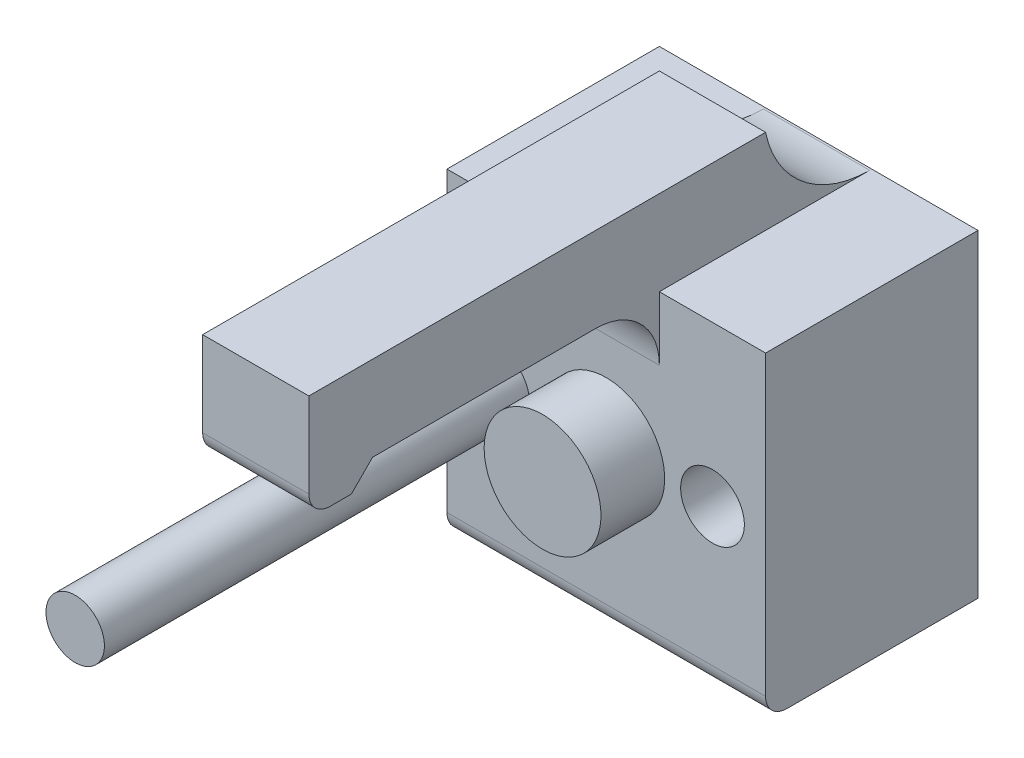
ISO-10303-21;
HEADER;
FILE_DESCRIPTION(('STEP AP214'),'2;1');
FILE_NAME('part.step','',(''),(''),'','','');
FILE_SCHEMA(('AUTOMOTIVE_DESIGN { 1 0 10303 214 1 1 1 1 }'));
ENDSEC;
DATA;
#1=APPLICATION_CONTEXT('core data for automotive mechanical design processes');
#2=APPLICATION_PROTOCOL_DEFINITION('international standard','automotive_design',2000,#1);
#3=PRODUCT_CONTEXT('',#1,'mechanical');
#4=PRODUCT('Part','Part','',(#3));
#5=PRODUCT_RELATED_PRODUCT_CATEGORY('part','',(#4));
#6=PRODUCT_DEFINITION_FORMATION('','',#4);
#7=PRODUCT_DEFINITION_CONTEXT('part definition',#1,'design');
#8=PRODUCT_DEFINITION('design','',#6,#7);
#9=PRODUCT_DEFINITION_SHAPE('','',#8);
#10=(LENGTH_UNIT() NAMED_UNIT(*) SI_UNIT(.MILLI.,.METRE.));
#11=(NAMED_UNIT(*) PLANE_ANGLE_UNIT() SI_UNIT($,.RADIAN.));
#12=(NAMED_UNIT(*) SI_UNIT($,.STERADIAN.) SOLID_ANGLE_UNIT());
#13=UNCERTAINTY_MEASURE_WITH_UNIT(LENGTH_MEASURE(1.E-05),#10,'distance_accuracy_value','');
#14=(GEOMETRIC_REPRESENTATION_CONTEXT(3) GLOBAL_UNCERTAINTY_ASSIGNED_CONTEXT((#13)) GLOBAL_UNIT_ASSIGNED_CONTEXT((#10,
#11,#12)) REPRESENTATION_CONTEXT('',''));
#15=CARTESIAN_POINT('',(0.,0.,0.));
#16=DIRECTION('',(0.,0.,1.));
#17=DIRECTION('',(1.,0.,0.));
#18=AXIS2_PLACEMENT_3D('',#15,#16,#17);
#19=CARTESIAN_POINT('',(0.,7.5,40.));
#20=DIRECTION('',(0.,1.,0.));
#21=DIRECTION('',(0.,0.,-1.));
#22=AXIS2_PLACEMENT_3D('',#19,#20,#21);
#23=PLANE('',#22);
#24=DIRECTION('',(0.,0.,1.));
#25=VECTOR('',#24,1.);
#26=CARTESIAN_POINT('',(-2.5,7.5,40.));
#27=LINE('',#26,#25);
#28=CARTESIAN_POINT('',(-2.5,7.5,43.));
#29=VERTEX_POINT('',#28);
#30=CARTESIAN_POINT('',(-2.5,7.5,53.5));
#31=VERTEX_POINT('',#30);
#32=EDGE_CURVE('E190',#29,#31,#27,.T.);
#33=ORIENTED_EDGE('',*,*,#32,.F.);
#34=DIRECTION('',(-1.,0.,0.));
#35=VECTOR('',#34,1.);
#36=CARTESIAN_POINT('',(0.,7.5,43.));
#37=LINE('',#36,#35);
#38=CARTESIAN_POINT('',(2.5,7.5,43.));
#39=VERTEX_POINT('',#38);
#40=EDGE_CURVE('E285',#39,#29,#37,.T.);
#41=ORIENTED_EDGE('',*,*,#40,.F.);
#42=DIRECTION('',(0.,0.,-1.));
#43=VECTOR('',#42,1.);
#44=CARTESIAN_POINT('',(2.5,7.5,40.));
#45=LINE('',#44,#43);
#46=CARTESIAN_POINT('',(2.5,7.5,53.5));
#47=VERTEX_POINT('',#46);
#48=EDGE_CURVE('E192',#47,#39,#45,.T.);
#49=ORIENTED_EDGE('',*,*,#48,.F.);
#50=DIRECTION('',(1.,0.,0.));
#51=VECTOR('',#50,1.);
#52=CARTESIAN_POINT('',(-3.9142135623731,7.5,53.5));
#53=LINE('',#52,#51);
#54=EDGE_CURVE('E177',#31,#47,#53,.T.);
#55=ORIENTED_EDGE('',*,*,#54,.F.);
#56=EDGE_LOOP('',(#33,#41,#49,#55));
#57=FACE_BOUND('',#56,.T.);
#58=ADVANCED_FACE('F43',(#57),#23,.F.);
#59=CARTESIAN_POINT('',(7.5,-7.5,30.));
#60=DIRECTION('',(-1.,0.,0.));
#61=DIRECTION('',(0.,0.,-1.));
#62=AXIS2_PLACEMENT_3D('',#59,#60,#61);
#63=PLANE('',#62);
#64=DIRECTION('',(0.,0.,1.));
#65=VECTOR('',#64,1.);
#66=CARTESIAN_POINT('',(7.5,-7.5,30.));
#67=LINE('',#66,#65);
#68=CARTESIAN_POINT('',(7.5,-7.5,30.));
#69=VERTEX_POINT('',#68);
#70=CARTESIAN_POINT('',(7.5,-7.5,39.));
#71=VERTEX_POINT('',#70);
#72=EDGE_CURVE('E250',#69,#71,#67,.T.);
#73=ORIENTED_EDGE('',*,*,#72,.F.);
#74=DIRECTION('',(0.,1.,0.));
#75=VECTOR('',#74,1.);
#76=CARTESIAN_POINT('',(7.5,-7.5,30.));
#77=LINE('',#76,#75);
#78=CARTESIAN_POINT('',(7.5,7.5,30.));
#79=VERTEX_POINT('',#78);
#80=EDGE_CURVE('E234',#69,#79,#77,.T.);
#81=ORIENTED_EDGE('',*,*,#80,.T.);
#82=DIRECTION('',(0.,0.,1.));
#83=VECTOR('',#82,1.);
#84=CARTESIAN_POINT('',(7.5,7.5,30.));
#85=LINE('',#84,#83);
#86=CARTESIAN_POINT('',(7.5,7.5,40.));
#87=VERTEX_POINT('',#86);
#88=EDGE_CURVE('E233',#79,#87,#85,.T.);
#89=ORIENTED_EDGE('',*,*,#88,.T.);
#90=DIRECTION('',(0.,1.,0.));
#91=VECTOR('',#90,1.);
#92=CARTESIAN_POINT('',(7.5,-7.5,40.));
#93=LINE('',#92,#91);
#94=CARTESIAN_POINT('',(7.5,-6.5,40.));
#95=VERTEX_POINT('',#94);
#96=EDGE_CURVE('E228',#95,#87,#93,.T.);
#97=ORIENTED_EDGE('',*,*,#96,.F.);
#98=CARTESIAN_POINT('',(7.5,-6.5,39.));
#99=DIRECTION('',(1.,0.,0.));
#100=DIRECTION('',(0.,0.,-1.));
#101=AXIS2_PLACEMENT_3D('',#98,#99,#100);
#102=CIRCLE('',#101,1.);
#103=EDGE_CURVE('E320',#71,#95,#102,.F.);
#104=ORIENTED_EDGE('',*,*,#103,.F.);
#105=EDGE_LOOP('',(#73,#81,#89,#97,#104));
#106=FACE_BOUND('',#105,.T.);
#107=ADVANCED_FACE('F429',(#106),#63,.F.);
#108=CARTESIAN_POINT('',(-7.5,7.5,30.));
#109=DIRECTION('',(0.,-1.,0.));
#110=DIRECTION('',(0.,0.,1.));
#111=AXIS2_PLACEMENT_3D('',#108,#109,#110);
#112=PLANE('',#111);
#113=CARTESIAN_POINT('',(2.5,7.5,40.));
#114=VERTEX_POINT('',#113);
#115=CARTESIAN_POINT('',(2.5,7.5,30.1010205144336));
#116=VERTEX_POINT('',#115);
#117=EDGE_CURVE('E215',#114,#116,#45,.T.);
#118=ORIENTED_EDGE('',*,*,#117,.F.);
#119=DIRECTION('',(-1.,0.,0.));
#120=VECTOR('',#119,1.);
#121=CARTESIAN_POINT('',(-7.5,7.5,40.));
#122=LINE('',#121,#120);
#123=EDGE_CURVE('E254',#87,#114,#122,.T.);
#124=ORIENTED_EDGE('',*,*,#123,.F.);
#125=ORIENTED_EDGE('',*,*,#88,.F.);
#126=DIRECTION('',(-1.,0.,0.));
#127=VECTOR('',#126,1.);
#128=CARTESIAN_POINT('',(-7.5,7.5,30.));
#129=LINE('',#128,#127);
#130=CARTESIAN_POINT('',(-7.5,7.5,30.));
#131=VERTEX_POINT('',#130);
#132=EDGE_CURVE('E238',#79,#131,#129,.T.);
#133=ORIENTED_EDGE('',*,*,#132,.T.);
#134=DIRECTION('',(0.,0.,1.));
#135=VECTOR('',#134,1.);
#136=CARTESIAN_POINT('',(-7.5,7.5,30.));
#137=LINE('',#136,#135);
#138=CARTESIAN_POINT('',(-7.5,7.5,40.));
#139=VERTEX_POINT('',#138);
#140=EDGE_CURVE('E267',#131,#139,#137,.T.);
#141=ORIENTED_EDGE('',*,*,#140,.T.);
#142=CARTESIAN_POINT('',(-2.5,7.5,40.));
#143=VERTEX_POINT('',#142);
#144=EDGE_CURVE('E253',#143,#139,#122,.T.);
#145=ORIENTED_EDGE('',*,*,#144,.F.);
#146=CARTESIAN_POINT('',(-2.5,7.5,30.1010205144336));
#147=VERTEX_POINT('',#146);
#148=EDGE_CURVE('E201',#147,#143,#27,.T.);
#149=ORIENTED_EDGE('',*,*,#148,.F.);
#150=DIRECTION('',(1.,0.,0.));
#151=VECTOR('',#150,1.);
#152=CARTESIAN_POINT('',(-7.5,7.5,30.1010205144336));
#153=LINE('',#152,#151);
#154=EDGE_CURVE('E274',#116,#147,#153,.F.);
#155=ORIENTED_EDGE('',*,*,#154,.F.);
#156=EDGE_LOOP('',(#118,#124,#125,#133,#141,#145,#149,#155));
#157=FACE_BOUND('',#156,.T.);
#158=ADVANCED_FACE('F438',(#157),#112,.F.);
#159=CARTESIAN_POINT('',(-7.5,-7.5,30.));
#160=DIRECTION('',(1.,0.,0.));
#161=DIRECTION('',(0.,0.,1.));
#162=AXIS2_PLACEMENT_3D('',#159,#160,#161);
#163=PLANE('',#162);
#164=DIRECTION('',(0.,-1.,0.));
#165=VECTOR('',#164,1.);
#166=CARTESIAN_POINT('',(-7.5,-7.5,40.));
#167=LINE('',#166,#165);
#168=CARTESIAN_POINT('',(-7.5,-6.5,40.));
#169=VERTEX_POINT('',#168);
#170=EDGE_CURVE('E239',#139,#169,#167,.T.);
#171=ORIENTED_EDGE('',*,*,#170,.F.);
#172=ORIENTED_EDGE('',*,*,#140,.F.);
#173=DIRECTION('',(0.,-1.,0.));
#174=VECTOR('',#173,1.);
#175=CARTESIAN_POINT('',(-7.5,-7.5,30.));
#176=LINE('',#175,#174);
#177=CARTESIAN_POINT('',(-7.5,-7.5,30.));
#178=VERTEX_POINT('',#177);
#179=EDGE_CURVE('E243',#131,#178,#176,.T.);
#180=ORIENTED_EDGE('',*,*,#179,.T.);
#181=DIRECTION('',(0.,0.,1.));
#182=VECTOR('',#181,1.);
#183=CARTESIAN_POINT('',(-7.5,-7.5,30.));
#184=LINE('',#183,#182);
#185=CARTESIAN_POINT('',(-7.5,-7.5,39.));
#186=VERTEX_POINT('',#185);
#187=EDGE_CURVE('E263',#178,#186,#184,.T.);
#188=ORIENTED_EDGE('',*,*,#187,.T.);
#189=CARTESIAN_POINT('',(-7.5,-6.5,39.));
#190=DIRECTION('',(-1.,0.,0.));
#191=DIRECTION('',(0.,0.,1.));
#192=AXIS2_PLACEMENT_3D('',#189,#190,#191);
#193=CIRCLE('',#192,1.);
#194=EDGE_CURVE('E11',#169,#186,#193,.F.);
#195=ORIENTED_EDGE('',*,*,#194,.F.);
#196=EDGE_LOOP('',(#171,#172,#180,#188,#195));
#197=FACE_BOUND('',#196,.T.);
#198=ADVANCED_FACE('F434',(#197),#163,.F.);
#199=CARTESIAN_POINT('',(-7.5,-7.5,30.));
#200=DIRECTION('',(0.,1.,0.));
#201=DIRECTION('',(0.,0.,-1.));
#202=AXIS2_PLACEMENT_3D('',#199,#200,#201);
#203=PLANE('',#202);
#204=DIRECTION('',(1.,0.,0.));
#205=VECTOR('',#204,1.);
#206=CARTESIAN_POINT('',(0.,-7.5,38.8385020515367));
#207=LINE('',#206,#205);
#208=CARTESIAN_POINT('',(-2.75,-7.5,38.8385020515367));
#209=VERTEX_POINT('',#208);
#210=CARTESIAN_POINT('',(2.75,-7.5,38.8385020515367));
#211=VERTEX_POINT('',#210);
#212=EDGE_CURVE('E369',#209,#211,#207,.T.);
#213=ORIENTED_EDGE('',*,*,#212,.T.);
#214=DIRECTION('',(0.,0.,1.));
#215=VECTOR('',#214,1.);
#216=CARTESIAN_POINT('',(2.75,-7.5,40.));
#217=LINE('',#216,#215);
#218=CARTESIAN_POINT('',(2.75,-7.5,31.1614979484633));
#219=VERTEX_POINT('',#218);
#220=EDGE_CURVE('E365',#219,#211,#217,.T.);
#221=ORIENTED_EDGE('',*,*,#220,.F.);
#222=DIRECTION('',(1.,0.,0.));
#223=VECTOR('',#222,1.);
#224=CARTESIAN_POINT('',(0.,-7.5,31.1614979484633));
#225=LINE('',#224,#223);
#226=CARTESIAN_POINT('',(-2.75,-7.5,31.1614979484633));
#227=VERTEX_POINT('',#226);
#228=EDGE_CURVE('E360',#227,#219,#225,.T.);
#229=ORIENTED_EDGE('',*,*,#228,.F.);
#230=DIRECTION('',(0.,0.,1.));
#231=VECTOR('',#230,1.);
#232=CARTESIAN_POINT('',(-2.75,-7.5,40.));
#233=LINE('',#232,#231);
#234=EDGE_CURVE('E185',#227,#209,#233,.T.);
#235=ORIENTED_EDGE('',*,*,#234,.T.);
#236=EDGE_LOOP('',(#213,#221,#229,#235));
#237=FACE_BOUND('',#236,.T.);
#238=ORIENTED_EDGE('',*,*,#187,.F.);
#239=DIRECTION('',(1.,0.,0.));
#240=VECTOR('',#239,1.);
#241=CARTESIAN_POINT('',(-7.5,-7.5,30.));
#242=LINE('',#241,#240);
#243=EDGE_CURVE('E247',#178,#69,#242,.T.);
#244=ORIENTED_EDGE('',*,*,#243,.T.);
#245=ORIENTED_EDGE('',*,*,#72,.T.);
#246=DIRECTION('',(1.,0.,0.));
#247=VECTOR('',#246,1.);
#248=CARTESIAN_POINT('',(7.5,-7.5,39.));
#249=LINE('',#248,#247);
#250=EDGE_CURVE('E317',#186,#71,#249,.T.);
#251=ORIENTED_EDGE('',*,*,#250,.F.);
#252=EDGE_LOOP('',(#238,#244,#245,#251));
#253=FACE_BOUND('',#252,.T.);
#254=ADVANCED_FACE('F421',(#237,#253),#203,.F.);
#255=CARTESIAN_POINT('',(0.,0.,30.));
#256=DIRECTION('',(0.,0.,1.));
#257=DIRECTION('',(-1.,0.,0.));
#258=AXIS2_PLACEMENT_3D('',#255,#256,#257);
#259=PLANE('',#258);
#260=CARTESIAN_POINT('',(5.,0.,30.));
#261=DIRECTION('',(0.,0.,-1.));
#262=DIRECTION('',(-1.,0.,0.));
#263=AXIS2_PLACEMENT_3D('',#260,#261,#262);
#264=CIRCLE('',#263,1.5);
#265=CARTESIAN_POINT('',(3.5,0.,30.));
#266=VERTEX_POINT('',#265);
#267=EDGE_CURVE('E396',#266,#266,#264,.T.);
#268=ORIENTED_EDGE('',*,*,#267,.F.);
#269=EDGE_LOOP('',(#268));
#270=FACE_BOUND('',#269,.T.);
#271=ORIENTED_EDGE('',*,*,#80,.F.);
#272=ORIENTED_EDGE('',*,*,#243,.F.);
#273=ORIENTED_EDGE('',*,*,#179,.F.);
#274=ORIENTED_EDGE('',*,*,#132,.F.);
#275=EDGE_LOOP('',(#271,#272,#273,#274));
#276=FACE_BOUND('',#275,.T.);
#277=ADVANCED_FACE('F418',(#270,#276),#259,.F.);
#278=CARTESIAN_POINT('',(0.,0.,40.));
#279=DIRECTION('',(0.,0.,1.));
#280=DIRECTION('',(-1.,0.,0.));
#281=AXIS2_PLACEMENT_3D('',#278,#279,#280);
#282=PLANE('',#281);
#283=CARTESIAN_POINT('',(5.,0.,40.));
#284=DIRECTION('',(0.,0.,-1.));
#285=DIRECTION('',(-1.,0.,0.));
#286=AXIS2_PLACEMENT_3D('',#283,#284,#285);
#287=CIRCLE('',#286,1.5);
#288=CARTESIAN_POINT('',(3.5,0.,40.));
#289=VERTEX_POINT('',#288);
#290=EDGE_CURVE('E403',#289,#289,#287,.T.);
#291=ORIENTED_EDGE('',*,*,#290,.T.);
#292=EDGE_LOOP('',(#291));
#293=FACE_BOUND('',#292,.T.);
#294=CARTESIAN_POINT('',(-5.,0.,40.));
#295=DIRECTION('',(0.,0.,-1.));
#296=DIRECTION('',(-1.,0.,0.));
#297=AXIS2_PLACEMENT_3D('',#294,#295,#296);
#298=CIRCLE('',#297,1.375);
#299=CARTESIAN_POINT('',(-6.375,0.,40.));
#300=VERTEX_POINT('',#299);
#301=EDGE_CURVE('E392',#300,#300,#298,.T.);
#302=ORIENTED_EDGE('',*,*,#301,.T.);
#303=EDGE_LOOP('',(#302));
#304=FACE_BOUND('',#303,.T.);
#305=CARTESIAN_POINT('',(0.,0.,40.));
#306=DIRECTION('',(0.,0.,-1.));
#307=DIRECTION('',(-1.,0.,0.));
#308=AXIS2_PLACEMENT_3D('',#305,#306,#307);
#309=CIRCLE('',#308,2.75);
#310=CARTESIAN_POINT('',(-2.75,0.,40.));
#311=VERTEX_POINT('',#310);
#312=EDGE_CURVE('E229',#311,#311,#309,.T.);
#313=ORIENTED_EDGE('',*,*,#312,.T.);
#314=EDGE_LOOP('',(#313));
#315=FACE_BOUND('',#314,.T.);
#316=ORIENTED_EDGE('',*,*,#96,.T.);
#317=ORIENTED_EDGE('',*,*,#123,.T.);
#318=DIRECTION('',(0.,1.,0.));
#319=VECTOR('',#318,1.);
#320=CARTESIAN_POINT('',(2.5,11.5,40.));
#321=LINE('',#320,#319);
#322=CARTESIAN_POINT('',(2.5,4.5,40.));
#323=VERTEX_POINT('',#322);
#324=EDGE_CURVE('E288',#323,#114,#321,.T.);
#325=ORIENTED_EDGE('',*,*,#324,.F.);
#326=DIRECTION('',(-1.,0.,0.));
#327=VECTOR('',#326,1.);
#328=CARTESIAN_POINT('',(0.,4.5,40.));
#329=LINE('',#328,#327);
#330=CARTESIAN_POINT('',(-2.5,4.5,40.));
#331=VERTEX_POINT('',#330);
#332=EDGE_CURVE('E291',#331,#323,#329,.F.);
#333=ORIENTED_EDGE('',*,*,#332,.F.);
#334=DIRECTION('',(0.,-1.,0.));
#335=VECTOR('',#334,1.);
#336=CARTESIAN_POINT('',(-2.5,11.5,40.));
#337=LINE('',#336,#335);
#338=EDGE_CURVE('E295',#143,#331,#337,.T.);
#339=ORIENTED_EDGE('',*,*,#338,.F.);
#340=ORIENTED_EDGE('',*,*,#144,.T.);
#341=ORIENTED_EDGE('',*,*,#170,.T.);
#342=DIRECTION('',(1.,0.,0.));
#343=VECTOR('',#342,1.);
#344=CARTESIAN_POINT('',(-7.5,-6.5,40.));
#345=LINE('',#344,#343);
#346=EDGE_CURVE('E52',#95,#169,#345,.F.);
#347=ORIENTED_EDGE('',*,*,#346,.F.);
#348=EDGE_LOOP('',(#316,#317,#325,#333,#339,#340,#341,#347));
#349=FACE_BOUND('',#348,.T.);
#350=ADVANCED_FACE('F408',(#293,#304,#315,#349),#282,.T.);
#351=CARTESIAN_POINT('',(0.,0.,43.));
#352=DIRECTION('',(0.,0.,-1.));
#353=DIRECTION('',(1.,0.,0.));
#354=AXIS2_PLACEMENT_3D('',#351,#352,#353);
#355=CYLINDRICAL_SURFACE('',#354,2.75);
#356=CARTESIAN_POINT('',(0.,0.,43.));
#357=DIRECTION('',(0.,0.,-1.));
#358=DIRECTION('',(-1.,0.,0.));
#359=AXIS2_PLACEMENT_3D('',#356,#357,#358);
#360=CIRCLE('',#359,2.75);
#361=CARTESIAN_POINT('',(-2.75,0.,43.));
#362=VERTEX_POINT('',#361);
#363=EDGE_CURVE('E224',#362,#362,#360,.T.);
#364=ORIENTED_EDGE('',*,*,#363,.T.);
#365=EDGE_LOOP('',(#364));
#366=FACE_BOUND('',#365,.T.);
#367=ORIENTED_EDGE('',*,*,#312,.F.);
#368=EDGE_LOOP('',(#367));
#369=FACE_BOUND('',#368,.T.);
#370=ADVANCED_FACE('F488',(#366,#369),#355,.T.);
#371=CARTESIAN_POINT('',(0.,0.,43.));
#372=DIRECTION('',(0.,0.,1.));
#373=DIRECTION('',(-1.,0.,0.));
#374=AXIS2_PLACEMENT_3D('',#371,#372,#373);
#375=PLANE('',#374);
#376=ORIENTED_EDGE('',*,*,#363,.F.);
#377=EDGE_LOOP('',(#376));
#378=FACE_BOUND('',#377,.T.);
#379=ADVANCED_FACE('F485',(#378),#375,.T.);
#380=CARTESIAN_POINT('',(-2.5,11.5,40.));
#381=DIRECTION('',(-1.,0.,0.));
#382=DIRECTION('',(0.,0.,-1.));
#383=AXIS2_PLACEMENT_3D('',#380,#381,#382);
#384=PLANE('',#383);
#385=DIRECTION('',(0.,-0.707106781186543,0.707106781186552));
#386=VECTOR('',#385,1.);
#387=CARTESIAN_POINT('',(-2.5,6.5,54.5));
#388=LINE('',#387,#386);
#389=CARTESIAN_POINT('',(-2.5,6.5,54.5));
#390=VERTEX_POINT('',#389);
#391=EDGE_CURVE('E173',#31,#390,#388,.T.);
#392=ORIENTED_EDGE('',*,*,#391,.T.);
#393=DIRECTION('',(0.,0.,1.));
#394=VECTOR('',#393,1.);
#395=CARTESIAN_POINT('',(-2.5,6.5,56.5));
#396=LINE('',#395,#394);
#397=CARTESIAN_POINT('',(-2.5,6.5,55.5));
#398=VERTEX_POINT('',#397);
#399=EDGE_CURVE('E344',#390,#398,#396,.T.);
#400=ORIENTED_EDGE('',*,*,#399,.T.);
#401=CARTESIAN_POINT('',(-2.5,7.5,55.5));
#402=DIRECTION('',(1.,0.,0.));
#403=DIRECTION('',(0.,0.,-1.));
#404=AXIS2_PLACEMENT_3D('',#401,#402,#403);
#405=CIRCLE('',#404,1.);
#406=CARTESIAN_POINT('',(-2.5,7.5,56.5));
#407=VERTEX_POINT('',#406);
#408=EDGE_CURVE('E313',#407,#398,#405,.T.);
#409=ORIENTED_EDGE('',*,*,#408,.F.);
#410=DIRECTION('',(0.,-1.,0.));
#411=VECTOR('',#410,1.);
#412=CARTESIAN_POINT('',(-2.5,11.5,56.5));
#413=LINE('',#412,#411);
#414=CARTESIAN_POINT('',(-2.5,11.5,56.5));
#415=VERTEX_POINT('',#414);
#416=EDGE_CURVE('E216',#415,#407,#413,.T.);
#417=ORIENTED_EDGE('',*,*,#416,.F.);
#418=DIRECTION('',(0.,0.,1.));
#419=VECTOR('',#418,1.);
#420=CARTESIAN_POINT('',(-2.5,11.5,40.));
#421=LINE('',#420,#419);
#422=CARTESIAN_POINT('',(-2.5,11.5,35.));
#423=VERTEX_POINT('',#422);
#424=EDGE_CURVE('E214',#423,#415,#421,.T.);
#425=ORIENTED_EDGE('',*,*,#424,.F.);
#426=CARTESIAN_POINT('',(-2.5,12.5,30.1010205144336));
#427=DIRECTION('',(1.,0.,0.));
#428=DIRECTION('',(0.,0.,-1.));
#429=AXIS2_PLACEMENT_3D('',#426,#427,#428);
#430=CIRCLE('',#429,5.);
#431=EDGE_CURVE('E281',#147,#423,#430,.F.);
#432=ORIENTED_EDGE('',*,*,#431,.F.);
#433=ORIENTED_EDGE('',*,*,#148,.T.);
#434=ORIENTED_EDGE('',*,*,#338,.T.);
#435=CARTESIAN_POINT('',(-2.5,4.5,43.));
#436=DIRECTION('',(1.,0.,0.));
#437=DIRECTION('',(0.,0.,-1.));
#438=AXIS2_PLACEMENT_3D('',#435,#436,#437);
#439=CIRCLE('',#438,3.);
#440=EDGE_CURVE('E198',#29,#331,#439,.F.);
#441=ORIENTED_EDGE('',*,*,#440,.F.);
#442=ORIENTED_EDGE('',*,*,#32,.T.);
#443=EDGE_LOOP('',(#392,#400,#409,#417,#425,#432,#433,#434,#441,#442));
#444=FACE_BOUND('',#443,.T.);
#445=ADVANCED_FACE('F196',(#444),#384,.T.);
#446=CARTESIAN_POINT('',(2.5,11.5,40.));
#447=DIRECTION('',(1.,0.,0.));
#448=DIRECTION('',(0.,0.,1.));
#449=AXIS2_PLACEMENT_3D('',#446,#447,#448);
#450=PLANE('',#449);
#451=ORIENTED_EDGE('',*,*,#48,.T.);
#452=CARTESIAN_POINT('',(2.5,4.5,43.));
#453=DIRECTION('',(-1.,0.,0.));
#454=DIRECTION('',(0.,0.,1.));
#455=AXIS2_PLACEMENT_3D('',#452,#453,#454);
#456=CIRCLE('',#455,3.);
#457=EDGE_CURVE('E300',#323,#39,#456,.F.);
#458=ORIENTED_EDGE('',*,*,#457,.F.);
#459=ORIENTED_EDGE('',*,*,#324,.T.);
#460=ORIENTED_EDGE('',*,*,#117,.T.);
#461=CARTESIAN_POINT('',(2.5,12.5,30.1010205144336));
#462=DIRECTION('',(-1.,0.,0.));
#463=DIRECTION('',(0.,0.,1.));
#464=AXIS2_PLACEMENT_3D('',#461,#462,#463);
#465=CIRCLE('',#464,5.);
#466=CARTESIAN_POINT('',(2.5,11.5,35.));
#467=VERTEX_POINT('',#466);
#468=EDGE_CURVE('E278',#467,#116,#465,.F.);
#469=ORIENTED_EDGE('',*,*,#468,.F.);
#470=DIRECTION('',(0.,0.,-1.));
#471=VECTOR('',#470,1.);
#472=CARTESIAN_POINT('',(2.5,11.5,40.));
#473=LINE('',#472,#471);
#474=CARTESIAN_POINT('',(2.5,11.5,56.5));
#475=VERTEX_POINT('',#474);
#476=EDGE_CURVE('E329',#475,#467,#473,.T.);
#477=ORIENTED_EDGE('',*,*,#476,.F.);
#478=DIRECTION('',(0.,-1.,0.));
#479=VECTOR('',#478,1.);
#480=CARTESIAN_POINT('',(2.5,11.5,56.5));
#481=LINE('',#480,#479);
#482=CARTESIAN_POINT('',(2.5,7.5,56.5));
#483=VERTEX_POINT('',#482);
#484=EDGE_CURVE('E220',#475,#483,#481,.T.);
#485=ORIENTED_EDGE('',*,*,#484,.T.);
#486=CARTESIAN_POINT('',(2.5,7.5,55.5));
#487=DIRECTION('',(-1.,0.,0.));
#488=DIRECTION('',(0.,0.,1.));
#489=AXIS2_PLACEMENT_3D('',#486,#487,#488);
#490=CIRCLE('',#489,1.);
#491=CARTESIAN_POINT('',(2.5,6.5,55.5));
#492=VERTEX_POINT('',#491);
#493=EDGE_CURVE('E306',#492,#483,#490,.T.);
#494=ORIENTED_EDGE('',*,*,#493,.F.);
#495=DIRECTION('',(0.,0.,-1.));
#496=VECTOR('',#495,1.);
#497=CARTESIAN_POINT('',(2.5,6.5,56.5));
#498=LINE('',#497,#496);
#499=CARTESIAN_POINT('',(2.5,6.5,54.5));
#500=VERTEX_POINT('',#499);
#501=EDGE_CURVE('E206',#492,#500,#498,.T.);
#502=ORIENTED_EDGE('',*,*,#501,.T.);
#503=DIRECTION('',(0.,-0.707106781186543,0.707106781186552));
#504=VECTOR('',#503,1.);
#505=CARTESIAN_POINT('',(2.5,6.5,54.5));
#506=LINE('',#505,#504);
#507=EDGE_CURVE('E194',#47,#500,#506,.T.);
#508=ORIENTED_EDGE('',*,*,#507,.F.);
#509=EDGE_LOOP('',(#451,#458,#459,#460,#469,#477,#485,#494,#502,#508));
#510=FACE_BOUND('',#509,.T.);
#511=ADVANCED_FACE('F445',(#510),#450,.T.);
#512=CARTESIAN_POINT('',(0.,11.5,56.5));
#513=DIRECTION('',(0.,0.,1.));
#514=DIRECTION('',(-1.,0.,0.));
#515=AXIS2_PLACEMENT_3D('',#512,#513,#514);
#516=PLANE('',#515);
#517=ORIENTED_EDGE('',*,*,#484,.F.);
#518=DIRECTION('',(1.,0.,0.));
#519=VECTOR('',#518,1.);
#520=CARTESIAN_POINT('',(0.,11.5,56.5));
#521=LINE('',#520,#519);
#522=EDGE_CURVE('E210',#415,#475,#521,.T.);
#523=ORIENTED_EDGE('',*,*,#522,.F.);
#524=ORIENTED_EDGE('',*,*,#416,.T.);
#525=DIRECTION('',(1.,0.,0.));
#526=VECTOR('',#525,1.);
#527=CARTESIAN_POINT('',(-2.5,7.5,56.5));
#528=LINE('',#527,#526);
#529=EDGE_CURVE('E310',#483,#407,#528,.F.);
#530=ORIENTED_EDGE('',*,*,#529,.F.);
#531=EDGE_LOOP('',(#517,#523,#524,#530));
#532=FACE_BOUND('',#531,.T.);
#533=ADVANCED_FACE('F455',(#532),#516,.T.);
#534=CARTESIAN_POINT('',(0.,11.5,40.));
#535=DIRECTION('',(0.,1.,0.));
#536=DIRECTION('',(0.,0.,-1.));
#537=AXIS2_PLACEMENT_3D('',#534,#535,#536);
#538=PLANE('',#537);
#539=ORIENTED_EDGE('',*,*,#424,.T.);
#540=ORIENTED_EDGE('',*,*,#522,.T.);
#541=ORIENTED_EDGE('',*,*,#476,.T.);
#542=DIRECTION('',(1.,0.,0.));
#543=VECTOR('',#542,1.);
#544=CARTESIAN_POINT('',(0.,11.5,35.));
#545=LINE('',#544,#543);
#546=EDGE_CURVE('E332',#423,#467,#545,.T.);
#547=ORIENTED_EDGE('',*,*,#546,.F.);
#548=EDGE_LOOP('',(#539,#540,#541,#547));
#549=FACE_BOUND('',#548,.T.);
#550=ADVANCED_FACE('F451',(#549),#538,.T.);
#551=CARTESIAN_POINT('',(0.,12.5,30.1010205144336));
#552=DIRECTION('',(1.,0.,0.));
#553=DIRECTION('',(0.,0.,1.));
#554=AXIS2_PLACEMENT_3D('',#551,#552,#553);
#555=CYLINDRICAL_SURFACE('',#554,5.);
#556=ORIENTED_EDGE('',*,*,#431,.T.);
#557=ORIENTED_EDGE('',*,*,#546,.T.);
#558=ORIENTED_EDGE('',*,*,#468,.T.);
#559=ORIENTED_EDGE('',*,*,#154,.T.);
#560=EDGE_LOOP('',(#556,#557,#558,#559));
#561=FACE_BOUND('',#560,.T.);
#562=ADVANCED_FACE('F450',(#561),#555,.F.);
#563=CARTESIAN_POINT('',(0.,4.5,43.));
#564=DIRECTION('',(-1.,0.,0.));
#565=DIRECTION('',(0.,0.,-1.));
#566=AXIS2_PLACEMENT_3D('',#563,#564,#565);
#567=CYLINDRICAL_SURFACE('',#566,3.);
#568=ORIENTED_EDGE('',*,*,#457,.T.);
#569=ORIENTED_EDGE('',*,*,#40,.T.);
#570=ORIENTED_EDGE('',*,*,#440,.T.);
#571=ORIENTED_EDGE('',*,*,#332,.T.);
#572=EDGE_LOOP('',(#568,#569,#570,#571));
#573=FACE_BOUND('',#572,.T.);
#574=ADVANCED_FACE('F448',(#573),#567,.F.);
#575=CARTESIAN_POINT('',(0.,6.5,40.));
#576=DIRECTION('',(0.,1.,0.));
#577=DIRECTION('',(0.,0.,-1.));
#578=AXIS2_PLACEMENT_3D('',#575,#576,#577);
#579=PLANE('',#578);
#580=ORIENTED_EDGE('',*,*,#399,.F.);
#581=DIRECTION('',(-1.,0.,0.));
#582=VECTOR('',#581,1.);
#583=CARTESIAN_POINT('',(-2.5,6.5,54.5));
#584=LINE('',#583,#582);
#585=EDGE_CURVE('E179',#500,#390,#584,.T.);
#586=ORIENTED_EDGE('',*,*,#585,.F.);
#587=ORIENTED_EDGE('',*,*,#501,.F.);
#588=DIRECTION('',(1.,0.,0.));
#589=VECTOR('',#588,1.);
#590=CARTESIAN_POINT('',(2.5,6.5,55.5));
#591=LINE('',#590,#589);
#592=EDGE_CURVE('E303',#398,#492,#591,.T.);
#593=ORIENTED_EDGE('',*,*,#592,.F.);
#594=EDGE_LOOP('',(#580,#586,#587,#593));
#595=FACE_BOUND('',#594,.T.);
#596=ADVANCED_FACE('F461',(#595),#579,.F.);
#597=CARTESIAN_POINT('',(0.,7.5,55.5));
#598=DIRECTION('',(-1.,0.,0.));
#599=DIRECTION('',(0.,0.,-1.));
#600=AXIS2_PLACEMENT_3D('',#597,#598,#599);
#601=CYLINDRICAL_SURFACE('',#600,1.);
#602=ORIENTED_EDGE('',*,*,#408,.T.);
#603=ORIENTED_EDGE('',*,*,#592,.T.);
#604=ORIENTED_EDGE('',*,*,#493,.T.);
#605=ORIENTED_EDGE('',*,*,#529,.T.);
#606=EDGE_LOOP('',(#602,#603,#604,#605));
#607=FACE_BOUND('',#606,.T.);
#608=ADVANCED_FACE('F458',(#607),#601,.T.);
#609=CARTESIAN_POINT('',(-2.75,-6.5,40.));
#610=DIRECTION('',(-1.,0.,0.));
#611=DIRECTION('',(0.,0.,-1.));
#612=AXIS2_PLACEMENT_3D('',#609,#610,#611);
#613=PLANE('',#612);
#614=ORIENTED_EDGE('',*,*,#234,.F.);
#615=DIRECTION('',(0.,-1.,0.));
#616=VECTOR('',#615,1.);
#617=CARTESIAN_POINT('',(-2.75,-6.5,31.1614979484633));
#618=LINE('',#617,#616);
#619=CARTESIAN_POINT('',(-2.75,-6.5,31.1614979484633));
#620=VERTEX_POINT('',#619);
#621=EDGE_CURVE('E347',#620,#227,#618,.T.);
#622=ORIENTED_EDGE('',*,*,#621,.F.);
#623=DIRECTION('',(0.,0.,1.));
#624=VECTOR('',#623,1.);
#625=CARTESIAN_POINT('',(-2.75,-6.5,40.));
#626=LINE('',#625,#624);
#627=CARTESIAN_POINT('',(-2.75,-6.5,38.8385020515367));
#628=VERTEX_POINT('',#627);
#629=EDGE_CURVE('E364',#620,#628,#626,.T.);
#630=ORIENTED_EDGE('',*,*,#629,.T.);
#631=DIRECTION('',(0.,-1.,0.));
#632=VECTOR('',#631,1.);
#633=CARTESIAN_POINT('',(-2.75,-6.5,38.8385020515367));
#634=LINE('',#633,#632);
#635=EDGE_CURVE('E348',#628,#209,#634,.T.);
#636=ORIENTED_EDGE('',*,*,#635,.T.);
#637=EDGE_LOOP('',(#614,#622,#630,#636));
#638=FACE_BOUND('',#637,.T.);
#639=ADVANCED_FACE('F468',(#638),#613,.F.);
#640=CARTESIAN_POINT('',(0.,-6.5,31.1614979484633));
#641=DIRECTION('',(0.,0.,1.));
#642=DIRECTION('',(-1.,0.,0.));
#643=AXIS2_PLACEMENT_3D('',#640,#641,#642);
#644=PLANE('',#643);
#645=ORIENTED_EDGE('',*,*,#228,.T.);
#646=DIRECTION('',(0.,-1.,0.));
#647=VECTOR('',#646,1.);
#648=CARTESIAN_POINT('',(2.75,-6.5,31.1614979484633));
#649=LINE('',#648,#647);
#650=CARTESIAN_POINT('',(2.75,-6.5,31.1614979484633));
#651=VERTEX_POINT('',#650);
#652=EDGE_CURVE('E355',#651,#219,#649,.T.);
#653=ORIENTED_EDGE('',*,*,#652,.F.);
#654=DIRECTION('',(1.,0.,0.));
#655=VECTOR('',#654,1.);
#656=CARTESIAN_POINT('',(0.,-6.5,31.1614979484633));
#657=LINE('',#656,#655);
#658=EDGE_CURVE('E352',#620,#651,#657,.T.);
#659=ORIENTED_EDGE('',*,*,#658,.F.);
#660=ORIENTED_EDGE('',*,*,#621,.T.);
#661=EDGE_LOOP('',(#645,#653,#659,#660));
#662=FACE_BOUND('',#661,.T.);
#663=ADVANCED_FACE('F626',(#662),#644,.T.);
#664=CARTESIAN_POINT('',(2.75,-6.5,40.));
#665=DIRECTION('',(-1.,0.,0.));
#666=DIRECTION('',(0.,0.,-1.));
#667=AXIS2_PLACEMENT_3D('',#664,#665,#666);
#668=PLANE('',#667);
#669=ORIENTED_EDGE('',*,*,#220,.T.);
#670=DIRECTION('',(0.,-1.,0.));
#671=VECTOR('',#670,1.);
#672=CARTESIAN_POINT('',(2.75,-6.5,38.8385020515367));
#673=LINE('',#672,#671);
#674=CARTESIAN_POINT('',(2.75,-6.5,38.8385020515367));
#675=VERTEX_POINT('',#674);
#676=EDGE_CURVE('E351',#675,#211,#673,.T.);
#677=ORIENTED_EDGE('',*,*,#676,.F.);
#678=DIRECTION('',(0.,0.,1.));
#679=VECTOR('',#678,1.);
#680=CARTESIAN_POINT('',(2.75,-6.5,40.));
#681=LINE('',#680,#679);
#682=EDGE_CURVE('E379',#651,#675,#681,.T.);
#683=ORIENTED_EDGE('',*,*,#682,.F.);
#684=ORIENTED_EDGE('',*,*,#652,.T.);
#685=EDGE_LOOP('',(#669,#677,#683,#684));
#686=FACE_BOUND('',#685,.T.);
#687=ADVANCED_FACE('F634',(#686),#668,.T.);
#688=CARTESIAN_POINT('',(0.,-6.5,38.8385020515367));
#689=DIRECTION('',(0.,0.,1.));
#690=DIRECTION('',(-1.,0.,0.));
#691=AXIS2_PLACEMENT_3D('',#688,#689,#690);
#692=PLANE('',#691);
#693=ORIENTED_EDGE('',*,*,#212,.F.);
#694=ORIENTED_EDGE('',*,*,#635,.F.);
#695=DIRECTION('',(1.,0.,0.));
#696=VECTOR('',#695,1.);
#697=CARTESIAN_POINT('',(0.,-6.5,38.8385020515367));
#698=LINE('',#697,#696);
#699=EDGE_CURVE('E383',#628,#675,#698,.T.);
#700=ORIENTED_EDGE('',*,*,#699,.T.);
#701=ORIENTED_EDGE('',*,*,#676,.T.);
#702=EDGE_LOOP('',(#693,#694,#700,#701));
#703=FACE_BOUND('',#702,.T.);
#704=ADVANCED_FACE('F643',(#703),#692,.F.);
#705=CARTESIAN_POINT('',(0.,-6.5,40.));
#706=DIRECTION('',(0.,-1.,0.));
#707=DIRECTION('',(0.,0.,1.));
#708=AXIS2_PLACEMENT_3D('',#705,#706,#707);
#709=PLANE('',#708);
#710=ORIENTED_EDGE('',*,*,#629,.F.);
#711=ORIENTED_EDGE('',*,*,#658,.T.);
#712=ORIENTED_EDGE('',*,*,#682,.T.);
#713=ORIENTED_EDGE('',*,*,#699,.F.);
#714=EDGE_LOOP('',(#710,#711,#712,#713));
#715=FACE_BOUND('',#714,.T.);
#716=ADVANCED_FACE('F652',(#715),#709,.T.);
#717=CARTESIAN_POINT('',(-7.5,-6.5,39.));
#718=DIRECTION('',(-1.,0.,0.));
#719=DIRECTION('',(0.,0.,-1.));
#720=AXIS2_PLACEMENT_3D('',#717,#718,#719);
#721=CYLINDRICAL_SURFACE('',#720,1.);
#722=ORIENTED_EDGE('',*,*,#194,.T.);
#723=ORIENTED_EDGE('',*,*,#250,.T.);
#724=ORIENTED_EDGE('',*,*,#103,.T.);
#725=ORIENTED_EDGE('',*,*,#346,.T.);
#726=EDGE_LOOP('',(#722,#723,#724,#725));
#727=FACE_BOUND('',#726,.T.);
#728=ADVANCED_FACE('F45',(#727),#721,.T.);
#729=CARTESIAN_POINT('',(-3.9142135623731,6.5,54.5));
#730=DIRECTION('',(0.,-0.707106781186552,-0.707106781186543));
#731=DIRECTION('',(0.,-0.707106781186543,0.707106781186552));
#732=AXIS2_PLACEMENT_3D('',#729,#730,#731);
#733=PLANE('',#732);
#734=ORIENTED_EDGE('',*,*,#54,.T.);
#735=ORIENTED_EDGE('',*,*,#507,.T.);
#736=ORIENTED_EDGE('',*,*,#585,.T.);
#737=ORIENTED_EDGE('',*,*,#391,.F.);
#738=EDGE_LOOP('',(#734,#735,#736,#737));
#739=FACE_BOUND('',#738,.T.);
#740=ADVANCED_FACE('F175',(#739),#733,.T.);
#741=CARTESIAN_POINT('',(-5.,0.,60.));
#742=DIRECTION('',(0.,0.,-1.));
#743=DIRECTION('',(1.,0.,0.));
#744=AXIS2_PLACEMENT_3D('',#741,#742,#743);
#745=CYLINDRICAL_SURFACE('',#744,1.375);
#746=CARTESIAN_POINT('',(-5.,0.,60.));
#747=DIRECTION('',(0.,0.,-1.));
#748=DIRECTION('',(-1.,0.,0.));
#749=AXIS2_PLACEMENT_3D('',#746,#747,#748);
#750=CIRCLE('',#749,1.375);
#751=CARTESIAN_POINT('',(-6.375,0.,60.));
#752=VERTEX_POINT('',#751);
#753=EDGE_CURVE('E391',#752,#752,#750,.T.);
#754=ORIENTED_EDGE('',*,*,#753,.T.);
#755=EDGE_LOOP('',(#754));
#756=FACE_BOUND('',#755,.T.);
#757=ORIENTED_EDGE('',*,*,#301,.F.);
#758=EDGE_LOOP('',(#757));
#759=FACE_BOUND('',#758,.T.);
#760=ADVANCED_FACE('F676',(#756,#759),#745,.T.);
#761=CARTESIAN_POINT('',(0.,0.,60.));
#762=DIRECTION('',(0.,0.,1.));
#763=DIRECTION('',(-1.,0.,0.));
#764=AXIS2_PLACEMENT_3D('',#761,#762,#763);
#765=PLANE('',#764);
#766=ORIENTED_EDGE('',*,*,#753,.F.);
#767=EDGE_LOOP('',(#766));
#768=FACE_BOUND('',#767,.T.);
#769=ADVANCED_FACE('F414',(#768),#765,.T.);
#770=CARTESIAN_POINT('',(5.,0.,20.));
#771=DIRECTION('',(0.,0.,1.));
#772=DIRECTION('',(-1.,0.,0.));
#773=AXIS2_PLACEMENT_3D('',#770,#771,#772);
#774=CYLINDRICAL_SURFACE('',#773,1.5);
#775=ORIENTED_EDGE('',*,*,#290,.F.);
#776=EDGE_LOOP('',(#775));
#777=FACE_BOUND('',#776,.T.);
#778=ORIENTED_EDGE('',*,*,#267,.T.);
#779=EDGE_LOOP('',(#778));
#780=FACE_BOUND('',#779,.T.);
#781=ADVANCED_FACE('F411',(#777,#780),#774,.F.);
#782=CLOSED_SHELL('',(#58,#107,#158,#198,#254,#277,#350,#370,#379,#445,#511,#533,#550,#562,#574,
#596,#608,#639,#663,#687,#704,#716,#728,#740,#760,#769,#781));
#783=MANIFOLD_SOLID_BREP('B2',#782);
#784=ADVANCED_BREP_SHAPE_REPRESENTATION('',(#18,#783),#14);
#785=SHAPE_DEFINITION_REPRESENTATION(#9,#784);
ENDSEC;
END-ISO-10303-21;
